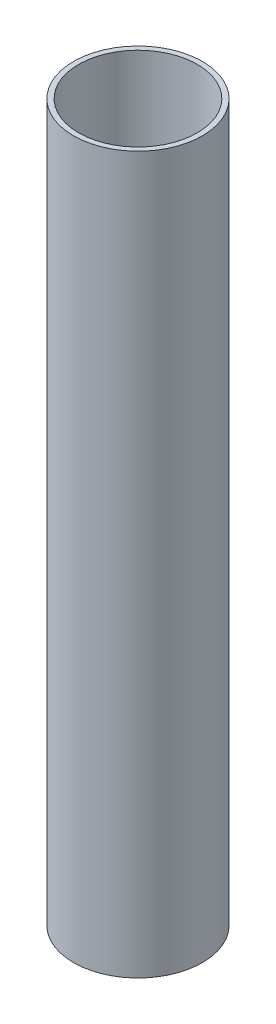
ISO-10303-21;
HEADER;
FILE_DESCRIPTION(('STEP AP214'),'2;1');
FILE_NAME('part.step','',(''),(''),'','','');
FILE_SCHEMA(('AUTOMOTIVE_DESIGN { 1 0 10303 214 1 1 1 1 }'));
ENDSEC;
DATA;
#1=APPLICATION_CONTEXT('core data for automotive mechanical design processes');
#2=APPLICATION_PROTOCOL_DEFINITION('international standard','automotive_design',2000,#1);
#3=PRODUCT_CONTEXT('',#1,'mechanical');
#4=PRODUCT('Part','Part','',(#3));
#5=PRODUCT_RELATED_PRODUCT_CATEGORY('part','',(#4));
#6=PRODUCT_DEFINITION_FORMATION('','',#4);
#7=PRODUCT_DEFINITION_CONTEXT('part definition',#1,'design');
#8=PRODUCT_DEFINITION('design','',#6,#7);
#9=PRODUCT_DEFINITION_SHAPE('','',#8);
#10=(LENGTH_UNIT() NAMED_UNIT(*) SI_UNIT(.MILLI.,.METRE.));
#11=(NAMED_UNIT(*) PLANE_ANGLE_UNIT() SI_UNIT($,.RADIAN.));
#12=(NAMED_UNIT(*) SI_UNIT($,.STERADIAN.) SOLID_ANGLE_UNIT());
#13=UNCERTAINTY_MEASURE_WITH_UNIT(LENGTH_MEASURE(1.E-05),#10,'distance_accuracy_value','');
#14=(GEOMETRIC_REPRESENTATION_CONTEXT(3) GLOBAL_UNCERTAINTY_ASSIGNED_CONTEXT((#13)) GLOBAL_UNIT_ASSIGNED_CONTEXT((#10,
#11,#12)) REPRESENTATION_CONTEXT('',''));
#15=CARTESIAN_POINT('',(0.,0.,0.));
#16=DIRECTION('',(0.,0.,1.));
#17=DIRECTION('',(1.,0.,0.));
#18=AXIS2_PLACEMENT_3D('',#15,#16,#17);
#19=CARTESIAN_POINT('',(0.,0.,0.));
#20=DIRECTION('',(0.,1.,0.));
#21=DIRECTION('',(0.,0.,1.));
#22=AXIS2_PLACEMENT_3D('',#19,#20,#21);
#23=CYLINDRICAL_SURFACE('',#22,29.);
#24=CARTESIAN_POINT('',(0.,0.,0.));
#25=DIRECTION('',(0.,1.,0.));
#26=DIRECTION('',(0.,0.,1.));
#27=AXIS2_PLACEMENT_3D('',#24,#25,#26);
#28=CIRCLE('',#27,29.);
#29=CARTESIAN_POINT('',(0.,0.,29.));
#30=VERTEX_POINT('',#29);
#31=EDGE_CURVE('E27',#30,#30,#28,.F.);
#32=ORIENTED_EDGE('',*,*,#31,.T.);
#33=EDGE_LOOP('',(#32));
#34=FACE_BOUND('',#33,.T.);
#35=CARTESIAN_POINT('',(0.,350.,0.));
#36=DIRECTION('',(0.,1.,0.));
#37=DIRECTION('',(0.,0.,1.));
#38=AXIS2_PLACEMENT_3D('',#35,#36,#37);
#39=CIRCLE('',#38,29.);
#40=CARTESIAN_POINT('',(0.,350.,29.));
#41=VERTEX_POINT('',#40);
#42=EDGE_CURVE('E18',#41,#41,#39,.F.);
#43=ORIENTED_EDGE('',*,*,#42,.F.);
#44=EDGE_LOOP('',(#43));
#45=FACE_BOUND('',#44,.T.);
#46=ADVANCED_FACE('F15',(#34,#45),#23,.F.);
#47=CARTESIAN_POINT('',(0.,350.,0.));
#48=DIRECTION('',(0.,1.,0.));
#49=DIRECTION('',(0.,0.,1.));
#50=AXIS2_PLACEMENT_3D('',#47,#48,#49);
#51=PLANE('',#50);
#52=ORIENTED_EDGE('',*,*,#42,.T.);
#53=EDGE_LOOP('',(#52));
#54=FACE_BOUND('',#53,.T.);
#55=CARTESIAN_POINT('',(0.,350.,0.));
#56=DIRECTION('',(0.,1.,0.));
#57=DIRECTION('',(0.,0.,1.));
#58=AXIS2_PLACEMENT_3D('',#55,#56,#57);
#59=CIRCLE('',#58,31.5);
#60=CARTESIAN_POINT('',(0.,350.,31.5));
#61=VERTEX_POINT('',#60);
#62=EDGE_CURVE('E22',#61,#61,#59,.F.);
#63=ORIENTED_EDGE('',*,*,#62,.F.);
#64=EDGE_LOOP('',(#63));
#65=FACE_BOUND('',#64,.T.);
#66=ADVANCED_FACE('F35',(#54,#65),#51,.T.);
#67=CARTESIAN_POINT('',(0.,0.,0.));
#68=DIRECTION('',(0.,1.,0.));
#69=DIRECTION('',(0.,0.,1.));
#70=AXIS2_PLACEMENT_3D('',#67,#68,#69);
#71=PLANE('',#70);
#72=ORIENTED_EDGE('',*,*,#31,.F.);
#73=EDGE_LOOP('',(#72));
#74=FACE_BOUND('',#73,.T.);
#75=CARTESIAN_POINT('',(0.,0.,0.));
#76=DIRECTION('',(0.,1.,0.));
#77=DIRECTION('',(0.,0.,1.));
#78=AXIS2_PLACEMENT_3D('',#75,#76,#77);
#79=CIRCLE('',#78,31.5);
#80=CARTESIAN_POINT('',(0.,0.,31.5));
#81=VERTEX_POINT('',#80);
#82=EDGE_CURVE('E10',#81,#81,#79,.T.);
#83=ORIENTED_EDGE('',*,*,#82,.F.);
#84=EDGE_LOOP('',(#83));
#85=FACE_BOUND('',#84,.T.);
#86=ADVANCED_FACE('F43',(#74,#85),#71,.F.);
#87=CARTESIAN_POINT('',(0.,0.,0.));
#88=DIRECTION('',(0.,1.,0.));
#89=DIRECTION('',(0.,0.,1.));
#90=AXIS2_PLACEMENT_3D('',#87,#88,#89);
#91=CYLINDRICAL_SURFACE('',#90,31.5);
#92=ORIENTED_EDGE('',*,*,#82,.T.);
#93=EDGE_LOOP('',(#92));
#94=FACE_BOUND('',#93,.T.);
#95=ORIENTED_EDGE('',*,*,#62,.T.);
#96=EDGE_LOOP('',(#95));
#97=FACE_BOUND('',#96,.T.);
#98=ADVANCED_FACE('F44',(#94,#97),#91,.T.);
#99=CLOSED_SHELL('',(#46,#66,#86,#98));
#100=MANIFOLD_SOLID_BREP('B1',#99);
#101=ADVANCED_BREP_SHAPE_REPRESENTATION('',(#18,#100),#14);
#102=SHAPE_DEFINITION_REPRESENTATION(#9,#101);
ENDSEC;
END-ISO-10303-21;
